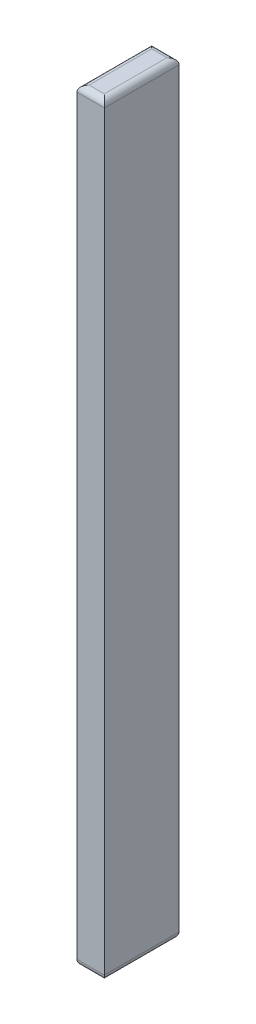
ISO-10303-21;
HEADER;
FILE_DESCRIPTION(('STEP AP214'),'2;1');
FILE_NAME('part.step','',(''),(''),'','','');
FILE_SCHEMA(('AUTOMOTIVE_DESIGN { 1 0 10303 214 1 1 1 1 }'));
ENDSEC;
DATA;
#1=APPLICATION_CONTEXT('core data for automotive mechanical design processes');
#2=APPLICATION_PROTOCOL_DEFINITION('international standard','automotive_design',2000,#1);
#3=PRODUCT_CONTEXT('',#1,'mechanical');
#4=PRODUCT('Part','Part','',(#3));
#5=PRODUCT_RELATED_PRODUCT_CATEGORY('part','',(#4));
#6=PRODUCT_DEFINITION_FORMATION('','',#4);
#7=PRODUCT_DEFINITION_CONTEXT('part definition',#1,'design');
#8=PRODUCT_DEFINITION('design','',#6,#7);
#9=PRODUCT_DEFINITION_SHAPE('','',#8);
#10=(LENGTH_UNIT() NAMED_UNIT(*) SI_UNIT(.MILLI.,.METRE.));
#11=(NAMED_UNIT(*) PLANE_ANGLE_UNIT() SI_UNIT($,.RADIAN.));
#12=(NAMED_UNIT(*) SI_UNIT($,.STERADIAN.) SOLID_ANGLE_UNIT());
#13=UNCERTAINTY_MEASURE_WITH_UNIT(LENGTH_MEASURE(1.E-05),#10,'distance_accuracy_value','');
#14=(GEOMETRIC_REPRESENTATION_CONTEXT(3) GLOBAL_UNCERTAINTY_ASSIGNED_CONTEXT((#13)) GLOBAL_UNIT_ASSIGNED_CONTEXT((#10,
#11,#12)) REPRESENTATION_CONTEXT('',''));
#15=CARTESIAN_POINT('',(0.,0.,0.));
#16=DIRECTION('',(0.,0.,1.));
#17=DIRECTION('',(1.,0.,0.));
#18=AXIS2_PLACEMENT_3D('',#15,#16,#17);
#19=CARTESIAN_POINT('',(0.,250.,0.));
#20=DIRECTION('',(1.,0.,0.));
#21=DIRECTION('',(0.,0.,-1.));
#22=AXIS2_PLACEMENT_3D('',#19,#20,#21);
#23=PLANE('',#22);
#24=DIRECTION('',(0.,-1.,0.));
#25=VECTOR('',#24,1.);
#26=CARTESIAN_POINT('',(0.,250.,-24.5));
#27=LINE('',#26,#25);
#28=CARTESIAN_POINT('',(0.,248.,-24.5));
#29=VERTEX_POINT('',#28);
#30=CARTESIAN_POINT('',(0.,2.,-24.5));
#31=VERTEX_POINT('',#30);
#32=EDGE_CURVE('E163',#29,#31,#27,.T.);
#33=ORIENTED_EDGE('',*,*,#32,.T.);
#34=DIRECTION('',(0.,0.,1.));
#35=VECTOR('',#34,1.);
#36=CARTESIAN_POINT('',(0.,2.,0.));
#37=LINE('',#36,#35);
#38=CARTESIAN_POINT('',(0.,2.,0.));
#39=VERTEX_POINT('',#38);
#40=EDGE_CURVE('E177',#31,#39,#37,.T.);
#41=ORIENTED_EDGE('',*,*,#40,.T.);
#42=DIRECTION('',(0.,-1.,0.));
#43=VECTOR('',#42,1.);
#44=CARTESIAN_POINT('',(0.,250.,0.));
#45=LINE('',#44,#43);
#46=CARTESIAN_POINT('',(0.,248.,0.));
#47=VERTEX_POINT('',#46);
#48=EDGE_CURVE('E134',#47,#39,#45,.T.);
#49=ORIENTED_EDGE('',*,*,#48,.F.);
#50=DIRECTION('',(0.,0.,1.));
#51=VECTOR('',#50,1.);
#52=CARTESIAN_POINT('',(0.,248.,0.));
#53=LINE('',#52,#51);
#54=EDGE_CURVE('E180',#47,#29,#53,.F.);
#55=ORIENTED_EDGE('',*,*,#54,.T.);
#56=EDGE_LOOP('',(#33,#41,#49,#55));
#57=FACE_BOUND('',#56,.T.);
#58=ADVANCED_FACE('F44',(#57),#23,.F.);
#59=CARTESIAN_POINT('',(0.,250.,0.));
#60=DIRECTION('',(0.,0.,-1.));
#61=DIRECTION('',(-1.,0.,0.));
#62=AXIS2_PLACEMENT_3D('',#59,#60,#61);
#63=PLANE('',#62);
#64=ORIENTED_EDGE('',*,*,#48,.T.);
#65=DIRECTION('',(1.,0.,0.));
#66=VECTOR('',#65,1.);
#67=CARTESIAN_POINT('',(9.,2.,0.));
#68=LINE('',#67,#66);
#69=CARTESIAN_POINT('',(9.,2.,0.));
#70=VERTEX_POINT('',#69);
#71=EDGE_CURVE('E132',#39,#70,#68,.T.);
#72=ORIENTED_EDGE('',*,*,#71,.T.);
#73=DIRECTION('',(0.,-1.,0.));
#74=VECTOR('',#73,1.);
#75=CARTESIAN_POINT('',(9.,250.,0.));
#76=LINE('',#75,#74);
#77=CARTESIAN_POINT('',(9.,248.,0.));
#78=VERTEX_POINT('',#77);
#79=EDGE_CURVE('E114',#78,#70,#76,.T.);
#80=ORIENTED_EDGE('',*,*,#79,.F.);
#81=DIRECTION('',(1.,0.,0.));
#82=VECTOR('',#81,1.);
#83=CARTESIAN_POINT('',(0.,248.,0.));
#84=LINE('',#83,#82);
#85=EDGE_CURVE('E129',#78,#47,#84,.F.);
#86=ORIENTED_EDGE('',*,*,#85,.T.);
#87=EDGE_LOOP('',(#64,#72,#80,#86));
#88=FACE_BOUND('',#87,.T.);
#89=ADVANCED_FACE('F128',(#88),#63,.F.);
#90=CARTESIAN_POINT('',(9.,250.,0.));
#91=DIRECTION('',(-1.,0.,0.));
#92=DIRECTION('',(0.,0.,1.));
#93=AXIS2_PLACEMENT_3D('',#90,#91,#92);
#94=PLANE('',#93);
#95=ORIENTED_EDGE('',*,*,#79,.T.);
#96=DIRECTION('',(0.,0.,-1.));
#97=VECTOR('',#96,1.);
#98=CARTESIAN_POINT('',(9.,2.,-24.5));
#99=LINE('',#98,#97);
#100=CARTESIAN_POINT('',(9.,2.,-24.5));
#101=VERTEX_POINT('',#100);
#102=EDGE_CURVE('E121',#70,#101,#99,.T.);
#103=ORIENTED_EDGE('',*,*,#102,.T.);
#104=DIRECTION('',(0.,-1.,0.));
#105=VECTOR('',#104,1.);
#106=CARTESIAN_POINT('',(9.,250.,-24.5));
#107=LINE('',#106,#105);
#108=CARTESIAN_POINT('',(9.,248.,-24.5));
#109=VERTEX_POINT('',#108);
#110=EDGE_CURVE('E116',#109,#101,#107,.T.);
#111=ORIENTED_EDGE('',*,*,#110,.F.);
#112=DIRECTION('',(0.,0.,-1.));
#113=VECTOR('',#112,1.);
#114=CARTESIAN_POINT('',(9.,248.,0.));
#115=LINE('',#114,#113);
#116=EDGE_CURVE('E111',#109,#78,#115,.F.);
#117=ORIENTED_EDGE('',*,*,#116,.T.);
#118=EDGE_LOOP('',(#95,#103,#111,#117));
#119=FACE_BOUND('',#118,.T.);
#120=ADVANCED_FACE('F113',(#119),#94,.F.);
#121=CARTESIAN_POINT('',(0.,250.,-24.5));
#122=DIRECTION('',(0.,0.,1.));
#123=DIRECTION('',(1.,0.,0.));
#124=AXIS2_PLACEMENT_3D('',#121,#122,#123);
#125=PLANE('',#124);
#126=ORIENTED_EDGE('',*,*,#110,.T.);
#127=DIRECTION('',(-1.,0.,0.));
#128=VECTOR('',#127,1.);
#129=CARTESIAN_POINT('',(0.,2.,-24.5));
#130=LINE('',#129,#128);
#131=EDGE_CURVE('E183',#101,#31,#130,.T.);
#132=ORIENTED_EDGE('',*,*,#131,.T.);
#133=ORIENTED_EDGE('',*,*,#32,.F.);
#134=DIRECTION('',(-1.,0.,0.));
#135=VECTOR('',#134,1.);
#136=CARTESIAN_POINT('',(0.,248.,-24.5));
#137=LINE('',#136,#135);
#138=EDGE_CURVE('E186',#29,#109,#137,.F.);
#139=ORIENTED_EDGE('',*,*,#138,.T.);
#140=EDGE_LOOP('',(#126,#132,#133,#139));
#141=FACE_BOUND('',#140,.T.);
#142=ADVANCED_FACE('F234',(#141),#125,.F.);
#143=CARTESIAN_POINT('',(0.,250.,0.));
#144=DIRECTION('',(0.,-1.,0.));
#145=DIRECTION('',(0.,0.,-1.));
#146=AXIS2_PLACEMENT_3D('',#143,#144,#145);
#147=PLANE('',#146);
#148=DIRECTION('',(0.,0.,-1.));
#149=VECTOR('',#148,1.);
#150=CARTESIAN_POINT('',(7.,250.,0.));
#151=LINE('',#150,#149);
#152=CARTESIAN_POINT('',(7.,250.,-2.));
#153=VERTEX_POINT('',#152);
#154=CARTESIAN_POINT('',(7.,250.,-22.5));
#155=VERTEX_POINT('',#154);
#156=EDGE_CURVE('E54',#153,#155,#151,.T.);
#157=ORIENTED_EDGE('',*,*,#156,.T.);
#158=DIRECTION('',(-1.,0.,0.));
#159=VECTOR('',#158,1.);
#160=CARTESIAN_POINT('',(0.,250.,-22.5));
#161=LINE('',#160,#159);
#162=CARTESIAN_POINT('',(2.,250.,-22.5));
#163=VERTEX_POINT('',#162);
#164=EDGE_CURVE('E11',#155,#163,#161,.T.);
#165=ORIENTED_EDGE('',*,*,#164,.T.);
#166=DIRECTION('',(0.,0.,1.));
#167=VECTOR('',#166,1.);
#168=CARTESIAN_POINT('',(2.,250.,0.));
#169=LINE('',#168,#167);
#170=CARTESIAN_POINT('',(2.,250.,-2.));
#171=VERTEX_POINT('',#170);
#172=EDGE_CURVE('E174',#163,#171,#169,.T.);
#173=ORIENTED_EDGE('',*,*,#172,.T.);
#174=DIRECTION('',(1.,0.,0.));
#175=VECTOR('',#174,1.);
#176=CARTESIAN_POINT('',(0.,250.,-2.));
#177=LINE('',#176,#175);
#178=EDGE_CURVE('E65',#171,#153,#177,.T.);
#179=ORIENTED_EDGE('',*,*,#178,.T.);
#180=EDGE_LOOP('',(#157,#165,#173,#179));
#181=FACE_BOUND('',#180,.T.);
#182=ADVANCED_FACE('F240',(#181),#147,.F.);
#183=CARTESIAN_POINT('',(0.,0.,0.));
#184=DIRECTION('',(0.,-1.,0.));
#185=DIRECTION('',(0.,0.,-1.));
#186=AXIS2_PLACEMENT_3D('',#183,#184,#185);
#187=PLANE('',#186);
#188=DIRECTION('',(0.,0.,-1.));
#189=VECTOR('',#188,1.);
#190=CARTESIAN_POINT('',(7.,0.,0.));
#191=LINE('',#190,#189);
#192=CARTESIAN_POINT('',(7.,0.,-22.5));
#193=VERTEX_POINT('',#192);
#194=CARTESIAN_POINT('',(7.,0.,-2.));
#195=VERTEX_POINT('',#194);
#196=EDGE_CURVE('E194',#193,#195,#191,.F.);
#197=ORIENTED_EDGE('',*,*,#196,.T.);
#198=DIRECTION('',(1.,0.,0.));
#199=VECTOR('',#198,1.);
#200=CARTESIAN_POINT('',(0.,0.,-2.));
#201=LINE('',#200,#199);
#202=CARTESIAN_POINT('',(2.,0.,-2.));
#203=VERTEX_POINT('',#202);
#204=EDGE_CURVE('E122',#195,#203,#201,.F.);
#205=ORIENTED_EDGE('',*,*,#204,.T.);
#206=DIRECTION('',(0.,0.,1.));
#207=VECTOR('',#206,1.);
#208=CARTESIAN_POINT('',(2.,0.,-24.5));
#209=LINE('',#208,#207);
#210=CARTESIAN_POINT('',(2.,0.,-22.5));
#211=VERTEX_POINT('',#210);
#212=EDGE_CURVE('E200',#203,#211,#209,.F.);
#213=ORIENTED_EDGE('',*,*,#212,.T.);
#214=DIRECTION('',(-1.,0.,0.));
#215=VECTOR('',#214,1.);
#216=CARTESIAN_POINT('',(9.,0.,-22.5));
#217=LINE('',#216,#215);
#218=EDGE_CURVE('E197',#211,#193,#217,.F.);
#219=ORIENTED_EDGE('',*,*,#218,.T.);
#220=EDGE_LOOP('',(#197,#205,#213,#219));
#221=FACE_BOUND('',#220,.T.);
#222=ADVANCED_FACE('F242',(#221),#187,.T.);
#223=CARTESIAN_POINT('',(0.,2.,-22.5));
#224=DIRECTION('',(1.,0.,0.));
#225=DIRECTION('',(0.,0.,-1.));
#226=AXIS2_PLACEMENT_3D('',#223,#224,#225);
#227=CYLINDRICAL_SURFACE('',#226,2.);
#228=CARTESIAN_POINT('',(7.,2.,-22.5));
#229=DIRECTION('',(0.707106781186547,0.,0.707106781186547));
#230=DIRECTION('',(0.707106781186547,0.,-0.707106781186547));
#231=AXIS2_PLACEMENT_3D('',#228,#229,#230);
#232=ELLIPSE('',#231,2.82842712474619,2.);
#233=EDGE_CURVE('E164',#193,#101,#232,.T.);
#234=ORIENTED_EDGE('',*,*,#233,.F.);
#235=ORIENTED_EDGE('',*,*,#218,.F.);
#236=CARTESIAN_POINT('',(2.,2.,-22.5));
#237=DIRECTION('',(0.707106781186547,0.,-0.707106781186547));
#238=DIRECTION('',(-0.707106781186547,0.,-0.707106781186547));
#239=AXIS2_PLACEMENT_3D('',#236,#237,#238);
#240=ELLIPSE('',#239,2.82842712474619,2.);
#241=EDGE_CURVE('E159',#31,#211,#240,.F.);
#242=ORIENTED_EDGE('',*,*,#241,.F.);
#243=ORIENTED_EDGE('',*,*,#131,.F.);
#244=EDGE_LOOP('',(#234,#235,#242,#243));
#245=FACE_BOUND('',#244,.T.);
#246=ADVANCED_FACE('F221',(#245),#227,.T.);
#247=CARTESIAN_POINT('',(2.,2.,0.));
#248=DIRECTION('',(0.,0.,-1.));
#249=DIRECTION('',(-1.,0.,0.));
#250=AXIS2_PLACEMENT_3D('',#247,#248,#249);
#251=CYLINDRICAL_SURFACE('',#250,2.);
#252=ORIENTED_EDGE('',*,*,#241,.T.);
#253=ORIENTED_EDGE('',*,*,#212,.F.);
#254=CARTESIAN_POINT('',(2.,2.,-2.));
#255=DIRECTION('',(-0.707106781186547,0.,-0.707106781186547));
#256=DIRECTION('',(0.707106781186547,0.,-0.707106781186547));
#257=AXIS2_PLACEMENT_3D('',#254,#255,#256);
#258=ELLIPSE('',#257,2.82842712474619,2.);
#259=EDGE_CURVE('E148',#39,#203,#258,.F.);
#260=ORIENTED_EDGE('',*,*,#259,.F.);
#261=ORIENTED_EDGE('',*,*,#40,.F.);
#262=EDGE_LOOP('',(#252,#253,#260,#261));
#263=FACE_BOUND('',#262,.T.);
#264=ADVANCED_FACE('F225',(#263),#251,.T.);
#265=CARTESIAN_POINT('',(7.,2.,0.));
#266=DIRECTION('',(0.,0.,1.));
#267=DIRECTION('',(1.,0.,0.));
#268=AXIS2_PLACEMENT_3D('',#265,#266,#267);
#269=CYLINDRICAL_SURFACE('',#268,2.);
#270=ORIENTED_EDGE('',*,*,#233,.T.);
#271=ORIENTED_EDGE('',*,*,#102,.F.);
#272=CARTESIAN_POINT('',(7.,2.,-2.));
#273=DIRECTION('',(-0.707106781186547,0.,0.707106781186547));
#274=DIRECTION('',(0.707106781186547,0.,0.707106781186547));
#275=AXIS2_PLACEMENT_3D('',#272,#273,#274);
#276=ELLIPSE('',#275,2.82842712474619,2.);
#277=EDGE_CURVE('E145',#195,#70,#276,.T.);
#278=ORIENTED_EDGE('',*,*,#277,.F.);
#279=ORIENTED_EDGE('',*,*,#196,.F.);
#280=EDGE_LOOP('',(#270,#271,#278,#279));
#281=FACE_BOUND('',#280,.T.);
#282=ADVANCED_FACE('F233',(#281),#269,.T.);
#283=CARTESIAN_POINT('',(0.,2.,-2.));
#284=DIRECTION('',(-1.,0.,0.));
#285=DIRECTION('',(0.,0.,1.));
#286=AXIS2_PLACEMENT_3D('',#283,#284,#285);
#287=CYLINDRICAL_SURFACE('',#286,2.);
#288=ORIENTED_EDGE('',*,*,#259,.T.);
#289=ORIENTED_EDGE('',*,*,#204,.F.);
#290=ORIENTED_EDGE('',*,*,#277,.T.);
#291=ORIENTED_EDGE('',*,*,#71,.F.);
#292=EDGE_LOOP('',(#288,#289,#290,#291));
#293=FACE_BOUND('',#292,.T.);
#294=ADVANCED_FACE('F228',(#293),#287,.T.);
#295=CARTESIAN_POINT('',(0.,248.,-2.));
#296=DIRECTION('',(1.,0.,0.));
#297=DIRECTION('',(0.,0.,-1.));
#298=AXIS2_PLACEMENT_3D('',#295,#296,#297);
#299=CYLINDRICAL_SURFACE('',#298,2.);
#300=CARTESIAN_POINT('',(2.,248.,-2.));
#301=DIRECTION('',(0.707106781186547,0.,0.707106781186547));
#302=DIRECTION('',(-0.707106781186547,0.,0.707106781186547));
#303=AXIS2_PLACEMENT_3D('',#300,#301,#302);
#304=ELLIPSE('',#303,2.82842712474619,2.);
#305=EDGE_CURVE('E139',#47,#171,#304,.F.);
#306=ORIENTED_EDGE('',*,*,#305,.F.);
#307=ORIENTED_EDGE('',*,*,#85,.F.);
#308=CARTESIAN_POINT('',(7.,248.,-2.));
#309=DIRECTION('',(0.707106781186547,0.,-0.707106781186547));
#310=DIRECTION('',(0.707106781186547,0.,0.707106781186547));
#311=AXIS2_PLACEMENT_3D('',#308,#309,#310);
#312=ELLIPSE('',#311,2.82842712474619,2.);
#313=EDGE_CURVE('E48',#153,#78,#312,.T.);
#314=ORIENTED_EDGE('',*,*,#313,.F.);
#315=ORIENTED_EDGE('',*,*,#178,.F.);
#316=EDGE_LOOP('',(#306,#307,#314,#315));
#317=FACE_BOUND('',#316,.T.);
#318=ADVANCED_FACE('F46',(#317),#299,.T.);
#319=CARTESIAN_POINT('',(7.,248.,0.));
#320=DIRECTION('',(0.,0.,-1.));
#321=DIRECTION('',(-1.,0.,0.));
#322=AXIS2_PLACEMENT_3D('',#319,#320,#321);
#323=CYLINDRICAL_SURFACE('',#322,2.);
#324=ORIENTED_EDGE('',*,*,#313,.T.);
#325=ORIENTED_EDGE('',*,*,#116,.F.);
#326=CARTESIAN_POINT('',(7.,248.,-22.5));
#327=DIRECTION('',(-0.707106781186547,0.,-0.707106781186547));
#328=DIRECTION('',(0.707106781186547,0.,-0.707106781186547));
#329=AXIS2_PLACEMENT_3D('',#326,#327,#328);
#330=ELLIPSE('',#329,2.82842712474619,2.);
#331=EDGE_CURVE('E150',#155,#109,#330,.T.);
#332=ORIENTED_EDGE('',*,*,#331,.F.);
#333=ORIENTED_EDGE('',*,*,#156,.F.);
#334=EDGE_LOOP('',(#324,#325,#332,#333));
#335=FACE_BOUND('',#334,.T.);
#336=ADVANCED_FACE('F143',(#335),#323,.T.);
#337=CARTESIAN_POINT('',(2.,248.,0.));
#338=DIRECTION('',(0.,0.,1.));
#339=DIRECTION('',(1.,0.,0.));
#340=AXIS2_PLACEMENT_3D('',#337,#338,#339);
#341=CYLINDRICAL_SURFACE('',#340,2.);
#342=ORIENTED_EDGE('',*,*,#305,.T.);
#343=ORIENTED_EDGE('',*,*,#172,.F.);
#344=CARTESIAN_POINT('',(2.,248.,-22.5));
#345=DIRECTION('',(-0.707106781186547,0.,0.707106781186547));
#346=DIRECTION('',(0.707106781186547,0.,0.707106781186547));
#347=AXIS2_PLACEMENT_3D('',#344,#345,#346);
#348=ELLIPSE('',#347,2.82842712474619,2.);
#349=EDGE_CURVE('E154',#29,#163,#348,.F.);
#350=ORIENTED_EDGE('',*,*,#349,.F.);
#351=ORIENTED_EDGE('',*,*,#54,.F.);
#352=EDGE_LOOP('',(#342,#343,#350,#351));
#353=FACE_BOUND('',#352,.T.);
#354=ADVANCED_FACE('F239',(#353),#341,.T.);
#355=CARTESIAN_POINT('',(0.,248.,-22.5));
#356=DIRECTION('',(-1.,0.,0.));
#357=DIRECTION('',(0.,0.,1.));
#358=AXIS2_PLACEMENT_3D('',#355,#356,#357);
#359=CYLINDRICAL_SURFACE('',#358,2.);
#360=ORIENTED_EDGE('',*,*,#331,.T.);
#361=ORIENTED_EDGE('',*,*,#138,.F.);
#362=ORIENTED_EDGE('',*,*,#349,.T.);
#363=ORIENTED_EDGE('',*,*,#164,.F.);
#364=EDGE_LOOP('',(#360,#361,#362,#363));
#365=FACE_BOUND('',#364,.T.);
#366=ADVANCED_FACE('F237',(#365),#359,.T.);
#367=CLOSED_SHELL('',(#58,#89,#120,#142,#182,#222,#246,#264,#282,#294,#318,#336,#354,#366));
#368=MANIFOLD_SOLID_BREP('B2',#367);
#369=ADVANCED_BREP_SHAPE_REPRESENTATION('',(#18,#368),#14);
#370=SHAPE_DEFINITION_REPRESENTATION(#9,#369);
ENDSEC;
END-ISO-10303-21;
